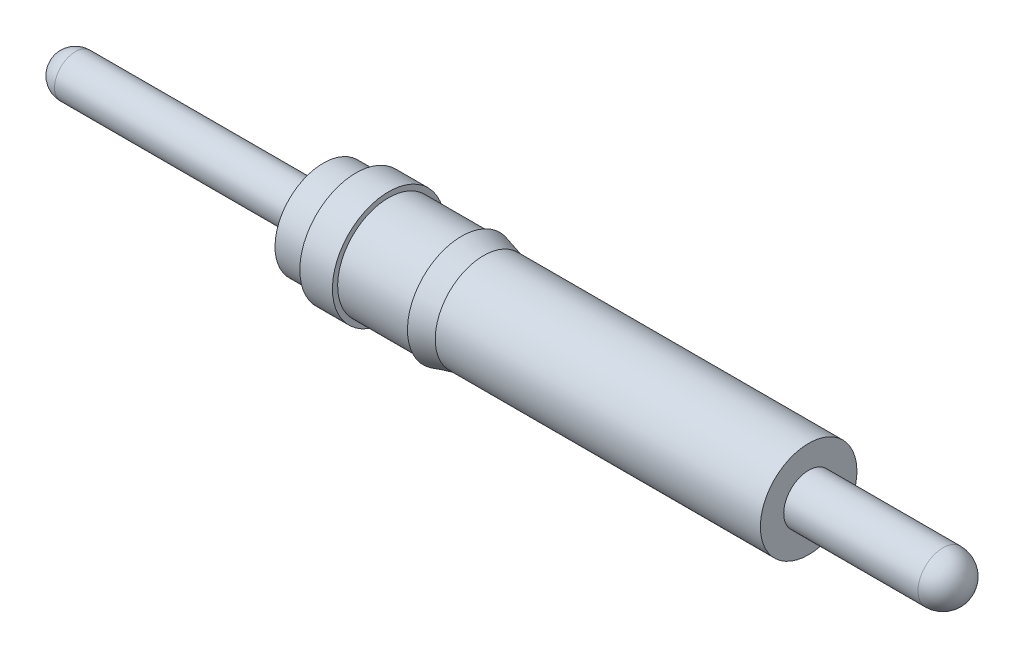
ISO-10303-21;
HEADER;
FILE_DESCRIPTION(('STEP AP214'),'2;1');
FILE_NAME('part.step','',(''),(''),'','','');
FILE_SCHEMA(('AUTOMOTIVE_DESIGN { 1 0 10303 214 1 1 1 1 }'));
ENDSEC;
DATA;
#1=APPLICATION_CONTEXT('core data for automotive mechanical design processes');
#2=APPLICATION_PROTOCOL_DEFINITION('international standard','automotive_design',2000,#1);
#3=PRODUCT_CONTEXT('',#1,'mechanical');
#4=PRODUCT('Part','Part','',(#3));
#5=PRODUCT_RELATED_PRODUCT_CATEGORY('part','',(#4));
#6=PRODUCT_DEFINITION_FORMATION('','',#4);
#7=PRODUCT_DEFINITION_CONTEXT('part definition',#1,'design');
#8=PRODUCT_DEFINITION('design','',#6,#7);
#9=PRODUCT_DEFINITION_SHAPE('','',#8);
#10=(LENGTH_UNIT() NAMED_UNIT(*) SI_UNIT(.MILLI.,.METRE.));
#11=(NAMED_UNIT(*) PLANE_ANGLE_UNIT() SI_UNIT($,.RADIAN.));
#12=(NAMED_UNIT(*) SI_UNIT($,.STERADIAN.) SOLID_ANGLE_UNIT());
#13=UNCERTAINTY_MEASURE_WITH_UNIT(LENGTH_MEASURE(1.E-05),#10,'distance_accuracy_value','');
#14=(GEOMETRIC_REPRESENTATION_CONTEXT(3) GLOBAL_UNCERTAINTY_ASSIGNED_CONTEXT((#13)) GLOBAL_UNIT_ASSIGNED_CONTEXT((#10,
#11,#12)) REPRESENTATION_CONTEXT('',''));
#15=CARTESIAN_POINT('',(0.,0.,0.));
#16=DIRECTION('',(0.,0.,1.));
#17=DIRECTION('',(1.,0.,0.));
#18=AXIS2_PLACEMENT_3D('',#15,#16,#17);
#19=CARTESIAN_POINT('',(0.203199999999993,0.,0.));
#20=DIRECTION('',(-1.,0.,0.));
#21=DIRECTION('',(0.,1.,0.));
#22=AXIS2_PLACEMENT_3D('',#19,#20,#21);
#23=SPHERICAL_SURFACE('',#22,0.203199999999993);
#24=CARTESIAN_POINT('',(0.203199999999993,0.,0.));
#25=DIRECTION('',(-1.,0.,0.));
#26=DIRECTION('',(0.,-1.,0.));
#27=AXIS2_PLACEMENT_3D('',#24,#25,#26);
#28=CIRCLE('',#27,0.203199999999993);
#29=CARTESIAN_POINT('',(0.203199999999993,-0.203200000000004,0.));
#30=VERTEX_POINT('',#29);
#31=EDGE_CURVE('E58',#30,#30,#28,.T.);
#32=ORIENTED_EDGE('',*,*,#31,.T.);
#33=EDGE_LOOP('',(#32));
#34=FACE_BOUND('',#33,.T.);
#35=ADVANCED_FACE('F15',(#34),#23,.T.);
#36=CARTESIAN_POINT('',(8.64743000000003,0.,0.));
#37=DIRECTION('',(-1.,0.,0.));
#38=DIRECTION('',(0.,-1.,0.));
#39=AXIS2_PLACEMENT_3D('',#36,#37,#38);
#40=SPHERICAL_SURFACE('',#39,0.24257);
#41=CARTESIAN_POINT('',(8.64743000000003,0.,0.));
#42=DIRECTION('',(-1.,0.,0.));
#43=DIRECTION('',(0.,-1.,0.));
#44=AXIS2_PLACEMENT_3D('',#41,#42,#43);
#45=CIRCLE('',#44,0.242570000000022);
#46=CARTESIAN_POINT('',(8.64743000000003,-0.242570000000032,0.));
#47=VERTEX_POINT('',#46);
#48=EDGE_CURVE('E10',#47,#47,#45,.T.);
#49=ORIENTED_EDGE('',*,*,#48,.F.);
#50=EDGE_LOOP('',(#49));
#51=FACE_BOUND('',#50,.T.);
#52=ADVANCED_FACE('F131',(#51),#40,.T.);
#53=CARTESIAN_POINT('',(0.,0.,0.));
#54=DIRECTION('',(-1.,0.,0.));
#55=DIRECTION('',(0.,-1.,0.));
#56=AXIS2_PLACEMENT_3D('',#53,#54,#55);
#57=CYLINDRICAL_SURFACE('',#56,0.242570000000022);
#58=CARTESIAN_POINT('',(7.3406,0.,0.));
#59=DIRECTION('',(-1.,0.,0.));
#60=DIRECTION('',(0.,-1.,0.));
#61=AXIS2_PLACEMENT_3D('',#58,#59,#60);
#62=CIRCLE('',#61,0.242570000000021);
#63=CARTESIAN_POINT('',(7.3406,-0.242570000000032,0.));
#64=VERTEX_POINT('',#63);
#65=EDGE_CURVE('E21',#64,#64,#62,.T.);
#66=ORIENTED_EDGE('',*,*,#65,.F.);
#67=EDGE_LOOP('',(#66));
#68=FACE_BOUND('',#67,.T.);
#69=ORIENTED_EDGE('',*,*,#48,.T.);
#70=EDGE_LOOP('',(#69));
#71=FACE_BOUND('',#70,.T.);
#72=ADVANCED_FACE('F125',(#68,#71),#57,.T.);
#73=CARTESIAN_POINT('',(7.3406,0.469900000000006,0.));
#74=DIRECTION('',(-1.,0.,0.));
#75=DIRECTION('',(0.,-1.,0.));
#76=AXIS2_PLACEMENT_3D('',#73,#74,#75);
#77=PLANE('',#76);
#78=CARTESIAN_POINT('',(7.3406,0.,0.));
#79=DIRECTION('',(-1.,0.,0.));
#80=DIRECTION('',(0.,-1.,0.));
#81=AXIS2_PLACEMENT_3D('',#78,#79,#80);
#82=CIRCLE('',#81,0.469900000000016);
#83=CARTESIAN_POINT('',(7.3406,-0.469900000000026,0.));
#84=VERTEX_POINT('',#83);
#85=EDGE_CURVE('E25',#84,#84,#82,.T.);
#86=ORIENTED_EDGE('',*,*,#85,.F.);
#87=EDGE_LOOP('',(#86));
#88=FACE_BOUND('',#87,.T.);
#89=ORIENTED_EDGE('',*,*,#65,.T.);
#90=EDGE_LOOP('',(#89));
#91=FACE_BOUND('',#90,.T.);
#92=ADVANCED_FACE('F120',(#88,#91),#77,.F.);
#93=CARTESIAN_POINT('',(0.,0.,0.));
#94=DIRECTION('',(-1.,0.,0.));
#95=DIRECTION('',(0.,-1.,0.));
#96=AXIS2_PLACEMENT_3D('',#93,#94,#95);
#97=CYLINDRICAL_SURFACE('',#96,0.469900000000016);
#98=CARTESIAN_POINT('',(4.17568670365232,0.,0.));
#99=DIRECTION('',(-1.,0.,0.));
#100=DIRECTION('',(0.,-1.,0.));
#101=AXIS2_PLACEMENT_3D('',#98,#99,#100);
#102=CIRCLE('',#101,0.469900000000016);
#103=CARTESIAN_POINT('',(4.17568670365232,-0.469900000000026,0.));
#104=VERTEX_POINT('',#103);
#105=EDGE_CURVE('E29',#104,#104,#102,.T.);
#106=ORIENTED_EDGE('',*,*,#105,.F.);
#107=EDGE_LOOP('',(#106));
#108=FACE_BOUND('',#107,.T.);
#109=ORIENTED_EDGE('',*,*,#85,.T.);
#110=EDGE_LOOP('',(#109));
#111=FACE_BOUND('',#110,.T.);
#112=ADVANCED_FACE('F114',(#108,#111),#97,.T.);
#113=CARTESIAN_POINT('',(4.17568670365232,0.,0.));
#114=DIRECTION('',(-1.,0.,0.));
#115=DIRECTION('',(0.,-1.,0.));
#116=AXIS2_PLACEMENT_3D('',#113,#114,#115);
#117=CONICAL_SURFACE('',#116,0.469900000000016,0.261799387799235);
#118=CARTESIAN_POINT('',(3.96239999999997,0.,0.));
#119=DIRECTION('',(-1.,0.,0.));
#120=DIRECTION('',(0.,-1.,0.));
#121=AXIS2_PLACEMENT_3D('',#118,#119,#120);
#122=CIRCLE('',#121,0.527049999999979);
#123=CARTESIAN_POINT('',(3.96239999999997,-0.52704999999999,0.));
#124=VERTEX_POINT('',#123);
#125=EDGE_CURVE('E34',#124,#124,#122,.T.);
#126=ORIENTED_EDGE('',*,*,#125,.F.);
#127=EDGE_LOOP('',(#126));
#128=FACE_BOUND('',#127,.T.);
#129=ORIENTED_EDGE('',*,*,#105,.T.);
#130=EDGE_LOOP('',(#129));
#131=FACE_BOUND('',#130,.T.);
#132=ADVANCED_FACE('F108',(#128,#131),#117,.T.);
#133=CARTESIAN_POINT('',(3.96239999999997,0.495299999999987,0.));
#134=DIRECTION('',(1.,0.,0.));
#135=DIRECTION('',(0.,1.,0.));
#136=AXIS2_PLACEMENT_3D('',#133,#134,#135);
#137=PLANE('',#136);
#138=CARTESIAN_POINT('',(3.96239999999997,0.,0.));
#139=DIRECTION('',(-1.,0.,0.));
#140=DIRECTION('',(0.,-1.,0.));
#141=AXIS2_PLACEMENT_3D('',#138,#139,#140);
#142=CIRCLE('',#141,0.495299999999997);
#143=CARTESIAN_POINT('',(3.96239999999997,-0.495300000000008,0.));
#144=VERTEX_POINT('',#143);
#145=EDGE_CURVE('E37',#144,#144,#142,.T.);
#146=ORIENTED_EDGE('',*,*,#145,.F.);
#147=EDGE_LOOP('',(#146));
#148=FACE_BOUND('',#147,.T.);
#149=ORIENTED_EDGE('',*,*,#125,.T.);
#150=EDGE_LOOP('',(#149));
#151=FACE_BOUND('',#150,.T.);
#152=ADVANCED_FACE('F102',(#148,#151),#137,.F.);
#153=CARTESIAN_POINT('',(0.,0.,0.));
#154=DIRECTION('',(-1.,0.,0.));
#155=DIRECTION('',(0.,-1.,0.));
#156=AXIS2_PLACEMENT_3D('',#153,#154,#155);
#157=CYLINDRICAL_SURFACE('',#156,0.495299999999997);
#158=CARTESIAN_POINT('',(3.2512,0.,0.));
#159=DIRECTION('',(-1.,0.,0.));
#160=DIRECTION('',(0.,-1.,0.));
#161=AXIS2_PLACEMENT_3D('',#158,#159,#160);
#162=CIRCLE('',#161,0.495299999999997);
#163=CARTESIAN_POINT('',(3.2512,-0.495300000000008,0.));
#164=VERTEX_POINT('',#163);
#165=EDGE_CURVE('E40',#164,#164,#162,.T.);
#166=ORIENTED_EDGE('',*,*,#165,.F.);
#167=EDGE_LOOP('',(#166));
#168=FACE_BOUND('',#167,.T.);
#169=ORIENTED_EDGE('',*,*,#145,.T.);
#170=EDGE_LOOP('',(#169));
#171=FACE_BOUND('',#170,.T.);
#172=ADVANCED_FACE('F96',(#168,#171),#157,.T.);
#173=CARTESIAN_POINT('',(3.2512,0.546100000000004,0.));
#174=DIRECTION('',(-1.,0.,0.));
#175=DIRECTION('',(0.,-1.,0.));
#176=AXIS2_PLACEMENT_3D('',#173,#174,#175);
#177=PLANE('',#176);
#178=CARTESIAN_POINT('',(3.2512,0.,0.));
#179=DIRECTION('',(-1.,0.,0.));
#180=DIRECTION('',(0.,-1.,0.));
#181=AXIS2_PLACEMENT_3D('',#178,#179,#180);
#182=CIRCLE('',#181,0.546100000000014);
#183=CARTESIAN_POINT('',(3.2512,-0.546100000000024,0.));
#184=VERTEX_POINT('',#183);
#185=EDGE_CURVE('E43',#184,#184,#182,.T.);
#186=ORIENTED_EDGE('',*,*,#185,.F.);
#187=EDGE_LOOP('',(#186));
#188=FACE_BOUND('',#187,.T.);
#189=ORIENTED_EDGE('',*,*,#165,.T.);
#190=EDGE_LOOP('',(#189));
#191=FACE_BOUND('',#190,.T.);
#192=ADVANCED_FACE('F90',(#188,#191),#177,.F.);
#193=CARTESIAN_POINT('',(0.,0.,0.));
#194=DIRECTION('',(-1.,0.,0.));
#195=DIRECTION('',(0.,-1.,0.));
#196=AXIS2_PLACEMENT_3D('',#193,#194,#195);
#197=CYLINDRICAL_SURFACE('',#196,0.546100000000014);
#198=CARTESIAN_POINT('',(2.93369999999998,0.,0.));
#199=DIRECTION('',(-1.,0.,0.));
#200=DIRECTION('',(0.,-1.,0.));
#201=AXIS2_PLACEMENT_3D('',#198,#199,#200);
#202=CIRCLE('',#201,0.546100000000014);
#203=CARTESIAN_POINT('',(2.93369999999998,-0.546100000000024,0.));
#204=VERTEX_POINT('',#203);
#205=EDGE_CURVE('E46',#204,#204,#202,.T.);
#206=ORIENTED_EDGE('',*,*,#205,.F.);
#207=EDGE_LOOP('',(#206));
#208=FACE_BOUND('',#207,.T.);
#209=ORIENTED_EDGE('',*,*,#185,.T.);
#210=EDGE_LOOP('',(#209));
#211=FACE_BOUND('',#210,.T.);
#212=ADVANCED_FACE('F84',(#208,#211),#197,.T.);
#213=CARTESIAN_POINT('',(2.93369999999998,0.469900000000006,0.));
#214=DIRECTION('',(1.,0.,0.));
#215=DIRECTION('',(0.,1.,0.));
#216=AXIS2_PLACEMENT_3D('',#213,#214,#215);
#217=PLANE('',#216);
#218=CARTESIAN_POINT('',(2.93369999999998,0.,0.));
#219=DIRECTION('',(-1.,0.,0.));
#220=DIRECTION('',(0.,-1.,0.));
#221=AXIS2_PLACEMENT_3D('',#218,#219,#220);
#222=CIRCLE('',#221,0.469900000000016);
#223=CARTESIAN_POINT('',(2.93369999999998,-0.469900000000026,0.));
#224=VERTEX_POINT('',#223);
#225=EDGE_CURVE('E49',#224,#224,#222,.T.);
#226=ORIENTED_EDGE('',*,*,#225,.F.);
#227=EDGE_LOOP('',(#226));
#228=FACE_BOUND('',#227,.T.);
#229=ORIENTED_EDGE('',*,*,#205,.T.);
#230=EDGE_LOOP('',(#229));
#231=FACE_BOUND('',#230,.T.);
#232=ADVANCED_FACE('F78',(#228,#231),#217,.F.);
#233=CARTESIAN_POINT('',(0.,0.,0.));
#234=DIRECTION('',(-1.,0.,0.));
#235=DIRECTION('',(0.,-1.,0.));
#236=AXIS2_PLACEMENT_3D('',#233,#234,#235);
#237=CYLINDRICAL_SURFACE('',#236,0.469900000000016);
#238=CARTESIAN_POINT('',(2.6162,0.,0.));
#239=DIRECTION('',(-1.,0.,0.));
#240=DIRECTION('',(0.,-1.,0.));
#241=AXIS2_PLACEMENT_3D('',#238,#239,#240);
#242=CIRCLE('',#241,0.469900000000016);
#243=CARTESIAN_POINT('',(2.6162,-0.469900000000026,0.));
#244=VERTEX_POINT('',#243);
#245=EDGE_CURVE('E52',#244,#244,#242,.T.);
#246=ORIENTED_EDGE('',*,*,#245,.F.);
#247=EDGE_LOOP('',(#246));
#248=FACE_BOUND('',#247,.T.);
#249=ORIENTED_EDGE('',*,*,#225,.T.);
#250=EDGE_LOOP('',(#249));
#251=FACE_BOUND('',#250,.T.);
#252=ADVANCED_FACE('F72',(#248,#251),#237,.T.);
#253=CARTESIAN_POINT('',(2.6162,0.203200000000002,0.));
#254=DIRECTION('',(1.,0.,0.));
#255=DIRECTION('',(0.,1.,0.));
#256=AXIS2_PLACEMENT_3D('',#253,#254,#255);
#257=PLANE('',#256);
#258=CARTESIAN_POINT('',(2.6162,0.,0.));
#259=DIRECTION('',(-1.,0.,0.));
#260=DIRECTION('',(0.,-1.,0.));
#261=AXIS2_PLACEMENT_3D('',#258,#259,#260);
#262=CIRCLE('',#261,0.203200000000012);
#263=CARTESIAN_POINT('',(2.6162,-0.203200000000023,0.));
#264=VERTEX_POINT('',#263);
#265=EDGE_CURVE('E55',#264,#264,#262,.T.);
#266=ORIENTED_EDGE('',*,*,#265,.F.);
#267=EDGE_LOOP('',(#266));
#268=FACE_BOUND('',#267,.T.);
#269=ORIENTED_EDGE('',*,*,#245,.T.);
#270=EDGE_LOOP('',(#269));
#271=FACE_BOUND('',#270,.T.);
#272=ADVANCED_FACE('F66',(#268,#271),#257,.F.);
#273=CARTESIAN_POINT('',(0.,0.,0.));
#274=DIRECTION('',(-1.,0.,0.));
#275=DIRECTION('',(0.,-1.,0.));
#276=AXIS2_PLACEMENT_3D('',#273,#274,#275);
#277=CYLINDRICAL_SURFACE('',#276,0.203200000000003);
#278=ORIENTED_EDGE('',*,*,#31,.F.);
#279=EDGE_LOOP('',(#278));
#280=FACE_BOUND('',#279,.T.);
#281=ORIENTED_EDGE('',*,*,#265,.T.);
#282=EDGE_LOOP('',(#281));
#283=FACE_BOUND('',#282,.T.);
#284=ADVANCED_FACE('F63',(#280,#283),#277,.T.);
#285=CLOSED_SHELL('',(#35,#52,#72,#92,#112,#132,#152,#172,#192,#212,#232,#252,#272,#284));
#286=MANIFOLD_SOLID_BREP('B1',#285);
#287=ADVANCED_BREP_SHAPE_REPRESENTATION('',(#18,#286),#14);
#288=SHAPE_DEFINITION_REPRESENTATION(#9,#287);
ENDSEC;
END-ISO-10303-21;
